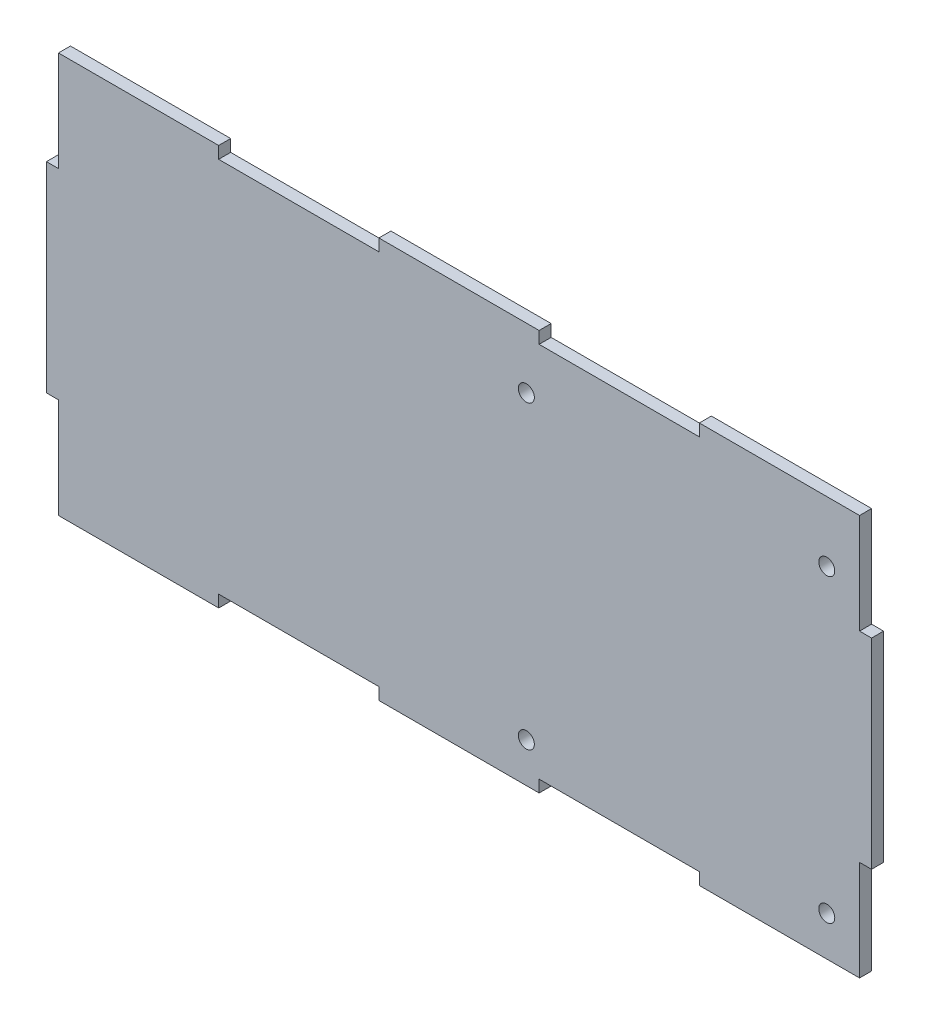
ISO-10303-21;
HEADER;
FILE_DESCRIPTION(('STEP AP214'),'2;1');
FILE_NAME('part.step','',(''),(''),'','','');
FILE_SCHEMA(('AUTOMOTIVE_DESIGN { 1 0 10303 214 1 1 1 1 }'));
ENDSEC;
DATA;
#1=APPLICATION_CONTEXT('core data for automotive mechanical design processes');
#2=APPLICATION_PROTOCOL_DEFINITION('international standard','automotive_design',2000,#1);
#3=PRODUCT_CONTEXT('',#1,'mechanical');
#4=PRODUCT('Part','Part','',(#3));
#5=PRODUCT_RELATED_PRODUCT_CATEGORY('part','',(#4));
#6=PRODUCT_DEFINITION_FORMATION('','',#4);
#7=PRODUCT_DEFINITION_CONTEXT('part definition',#1,'design');
#8=PRODUCT_DEFINITION('design','',#6,#7);
#9=PRODUCT_DEFINITION_SHAPE('','',#8);
#10=(LENGTH_UNIT() NAMED_UNIT(*) SI_UNIT(.MILLI.,.METRE.));
#11=(NAMED_UNIT(*) PLANE_ANGLE_UNIT() SI_UNIT($,.RADIAN.));
#12=(NAMED_UNIT(*) SI_UNIT($,.STERADIAN.) SOLID_ANGLE_UNIT());
#13=UNCERTAINTY_MEASURE_WITH_UNIT(LENGTH_MEASURE(1.E-05),#10,'distance_accuracy_value','');
#14=(GEOMETRIC_REPRESENTATION_CONTEXT(3) GLOBAL_UNCERTAINTY_ASSIGNED_CONTEXT((#13)) GLOBAL_UNIT_ASSIGNED_CONTEXT((#10,
#11,#12)) REPRESENTATION_CONTEXT('',''));
#15=CARTESIAN_POINT('',(0.,0.,0.));
#16=DIRECTION('',(0.,0.,1.));
#17=DIRECTION('',(1.,0.,0.));
#18=AXIS2_PLACEMENT_3D('',#15,#16,#17);
#19=CARTESIAN_POINT('',(193.,282.5,20.));
#20=DIRECTION('',(0.,0.,-1.));
#21=DIRECTION('',(-1.,0.,0.));
#22=AXIS2_PLACEMENT_3D('',#19,#20,#21);
#23=PLANE('',#22);
#24=CARTESIAN_POINT('',(209.810379423596,90.8991683153379,20.));
#25=DIRECTION('',(0.,0.,1.));
#26=DIRECTION('',(1.,0.,0.));
#27=AXIS2_PLACEMENT_3D('',#24,#25,#26);
#28=CIRCLE('',#27,1.99999999999999);
#29=CARTESIAN_POINT('',(211.810379423596,90.8991683153379,20.));
#30=VERTEX_POINT('',#29);
#31=EDGE_CURVE('E236',#30,#30,#28,.T.);
#32=ORIENTED_EDGE('',*,*,#31,.T.);
#33=EDGE_LOOP('',(#32));
#34=FACE_BOUND('',#33,.T.);
#35=CARTESIAN_POINT('',(209.810379423596,165.899168315338,20.));
#36=DIRECTION('',(0.,0.,1.));
#37=DIRECTION('',(1.,0.,0.));
#38=AXIS2_PLACEMENT_3D('',#35,#36,#37);
#39=CIRCLE('',#38,1.99999999999999);
#40=CARTESIAN_POINT('',(211.810379423596,165.899168315338,20.));
#41=VERTEX_POINT('',#40);
#42=EDGE_CURVE('E240',#41,#41,#39,.T.);
#43=ORIENTED_EDGE('',*,*,#42,.T.);
#44=EDGE_LOOP('',(#43));
#45=FACE_BOUND('',#44,.T.);
#46=CARTESIAN_POINT('',(284.810379423596,90.8991683153379,20.));
#47=DIRECTION('',(0.,0.,1.));
#48=DIRECTION('',(1.,0.,0.));
#49=AXIS2_PLACEMENT_3D('',#46,#47,#48);
#50=CIRCLE('',#49,1.99999999999999);
#51=CARTESIAN_POINT('',(286.810379423596,90.8991683153379,20.));
#52=VERTEX_POINT('',#51);
#53=EDGE_CURVE('E242',#52,#52,#50,.T.);
#54=ORIENTED_EDGE('',*,*,#53,.T.);
#55=EDGE_LOOP('',(#54));
#56=FACE_BOUND('',#55,.T.);
#57=CARTESIAN_POINT('',(284.810379423596,165.899168315338,20.));
#58=DIRECTION('',(0.,0.,1.));
#59=DIRECTION('',(1.,0.,0.));
#60=AXIS2_PLACEMENT_3D('',#57,#58,#59);
#61=CIRCLE('',#60,1.99999999999999);
#62=CARTESIAN_POINT('',(286.810379423596,165.899168315338,20.));
#63=VERTEX_POINT('',#62);
#64=EDGE_CURVE('E20',#63,#63,#61,.T.);
#65=ORIENTED_EDGE('',*,*,#64,.T.);
#66=EDGE_LOOP('',(#65));
#67=FACE_BOUND('',#66,.T.);
#68=DIRECTION('',(0.,1.,0.));
#69=VECTOR('',#68,1.);
#70=CARTESIAN_POINT('',(253.,181.,20.));
#71=LINE('',#70,#69);
#72=CARTESIAN_POINT('',(253.,181.,20.));
#73=VERTEX_POINT('',#72);
#74=CARTESIAN_POINT('',(253.,178.,20.));
#75=VERTEX_POINT('',#74);
#76=EDGE_CURVE('E207',#73,#75,#71,.F.);
#77=ORIENTED_EDGE('',*,*,#76,.F.);
#78=DIRECTION('',(1.,0.,0.));
#79=VECTOR('',#78,1.);
#80=CARTESIAN_POINT('',(273.,181.,20.));
#81=LINE('',#80,#79);
#82=CARTESIAN_POINT('',(293.,181.,20.0000000000001));
#83=VERTEX_POINT('',#82);
#84=EDGE_CURVE('E200',#73,#83,#81,.T.);
#85=ORIENTED_EDGE('',*,*,#84,.T.);
#86=DIRECTION('',(0.,1.,0.));
#87=VECTOR('',#86,1.);
#88=CARTESIAN_POINT('',(293.,181.,20.0000000000004));
#89=LINE('',#88,#87);
#90=CARTESIAN_POINT('',(293.,156.,20.0000000000003));
#91=VERTEX_POINT('',#90);
#92=EDGE_CURVE('E204',#91,#83,#89,.T.);
#93=ORIENTED_EDGE('',*,*,#92,.F.);
#94=DIRECTION('',(1.,0.,0.));
#95=VECTOR('',#94,1.);
#96=CARTESIAN_POINT('',(396.,156.,20.0000000000004));
#97=LINE('',#96,#95);
#98=CARTESIAN_POINT('',(296.,156.,20.0000000000001));
#99=VERTEX_POINT('',#98);
#100=EDGE_CURVE('E249',#91,#99,#97,.T.);
#101=ORIENTED_EDGE('',*,*,#100,.T.);
#102=DIRECTION('',(0.,1.,0.));
#103=VECTOR('',#102,1.);
#104=CARTESIAN_POINT('',(296.,281.,20.0000000000002));
#105=LINE('',#104,#103);
#106=CARTESIAN_POINT('',(296.,106.,20.0000000000001));
#107=VERTEX_POINT('',#106);
#108=EDGE_CURVE('E256',#107,#99,#105,.T.);
#109=ORIENTED_EDGE('',*,*,#108,.F.);
#110=DIRECTION('',(1.,0.,0.));
#111=VECTOR('',#110,1.);
#112=CARTESIAN_POINT('',(399.,106.,20.0000000000002));
#113=LINE('',#112,#111);
#114=CARTESIAN_POINT('',(293.,106.,20.0000000000001));
#115=VERTEX_POINT('',#114);
#116=EDGE_CURVE('E263',#107,#115,#113,.F.);
#117=ORIENTED_EDGE('',*,*,#116,.T.);
#118=DIRECTION('',(0.,1.,0.));
#119=VECTOR('',#118,1.);
#120=CARTESIAN_POINT('',(293.,169.,20.0000000000002));
#121=LINE('',#120,#119);
#122=CARTESIAN_POINT('',(293.,81.,20.0000000000001));
#123=VERTEX_POINT('',#122);
#124=EDGE_CURVE('E265',#115,#123,#121,.F.);
#125=ORIENTED_EDGE('',*,*,#124,.T.);
#126=DIRECTION('',(1.,0.,0.));
#127=VECTOR('',#126,1.);
#128=CARTESIAN_POINT('',(196.,81.,20.));
#129=LINE('',#128,#127);
#130=CARTESIAN_POINT('',(253.014555047567,81.,20.));
#131=VERTEX_POINT('',#130);
#132=EDGE_CURVE('E272',#123,#131,#129,.F.);
#133=ORIENTED_EDGE('',*,*,#132,.T.);
#134=DIRECTION('',(0.,1.,0.));
#135=VECTOR('',#134,1.);
#136=CARTESIAN_POINT('',(253.014555047567,78.,20.));
#137=LINE('',#136,#135);
#138=CARTESIAN_POINT('',(253.014555047567,84.,20.));
#139=VERTEX_POINT('',#138);
#140=EDGE_CURVE('E276',#131,#139,#137,.T.);
#141=ORIENTED_EDGE('',*,*,#140,.T.);
#142=DIRECTION('',(1.,0.,0.));
#143=VECTOR('',#142,1.);
#144=CARTESIAN_POINT('',(233.014555047567,84.,20.));
#145=LINE('',#144,#143);
#146=CARTESIAN_POINT('',(213.014555047567,84.,20.));
#147=VERTEX_POINT('',#146);
#148=EDGE_CURVE('E280',#139,#147,#145,.F.);
#149=ORIENTED_EDGE('',*,*,#148,.T.);
#150=DIRECTION('',(0.,1.,0.));
#151=VECTOR('',#150,1.);
#152=CARTESIAN_POINT('',(213.014555047567,78.,20.));
#153=LINE('',#152,#151);
#154=CARTESIAN_POINT('',(213.014555047567,81.,20.));
#155=VERTEX_POINT('',#154);
#156=EDGE_CURVE('E284',#147,#155,#153,.F.);
#157=ORIENTED_EDGE('',*,*,#156,.T.);
#158=DIRECTION('',(1.,0.,0.));
#159=VECTOR('',#158,1.);
#160=CARTESIAN_POINT('',(196.,81.,20.));
#161=LINE('',#160,#159);
#162=CARTESIAN_POINT('',(173.014555047567,81.,20.));
#163=VERTEX_POINT('',#162);
#164=EDGE_CURVE('E288',#155,#163,#161,.F.);
#165=ORIENTED_EDGE('',*,*,#164,.T.);
#166=DIRECTION('',(0.,1.,0.));
#167=VECTOR('',#166,1.);
#168=CARTESIAN_POINT('',(173.014555047567,78.,20.));
#169=LINE('',#168,#167);
#170=CARTESIAN_POINT('',(173.014555047567,84.,20.));
#171=VERTEX_POINT('',#170);
#172=EDGE_CURVE('E292',#163,#171,#169,.T.);
#173=ORIENTED_EDGE('',*,*,#172,.T.);
#174=DIRECTION('',(1.,0.,0.));
#175=VECTOR('',#174,1.);
#176=CARTESIAN_POINT('',(153.014555047567,84.,20.));
#177=LINE('',#176,#175);
#178=CARTESIAN_POINT('',(133.014555047567,84.,20.));
#179=VERTEX_POINT('',#178);
#180=EDGE_CURVE('E296',#171,#179,#177,.F.);
#181=ORIENTED_EDGE('',*,*,#180,.T.);
#182=DIRECTION('',(0.,1.,0.));
#183=VECTOR('',#182,1.);
#184=CARTESIAN_POINT('',(133.014555047567,78.,20.));
#185=LINE('',#184,#183);
#186=CARTESIAN_POINT('',(133.014555047567,81.,20.));
#187=VERTEX_POINT('',#186);
#188=EDGE_CURVE('E300',#179,#187,#185,.F.);
#189=ORIENTED_EDGE('',*,*,#188,.T.);
#190=DIRECTION('',(1.,0.,0.));
#191=VECTOR('',#190,1.);
#192=CARTESIAN_POINT('',(196.,81.,20.));
#193=LINE('',#192,#191);
#194=CARTESIAN_POINT('',(93.,81.,20.));
#195=VERTEX_POINT('',#194);
#196=EDGE_CURVE('E304',#187,#195,#193,.F.);
#197=ORIENTED_EDGE('',*,*,#196,.T.);
#198=DIRECTION('',(0.,1.,0.));
#199=VECTOR('',#198,1.);
#200=CARTESIAN_POINT('',(93.,79.5,20.));
#201=LINE('',#200,#199);
#202=CARTESIAN_POINT('',(93.,106.,20.));
#203=VERTEX_POINT('',#202);
#204=EDGE_CURVE('E308',#195,#203,#201,.T.);
#205=ORIENTED_EDGE('',*,*,#204,.T.);
#206=DIRECTION('',(1.,0.,0.));
#207=VECTOR('',#206,1.);
#208=CARTESIAN_POINT('',(196.,106.,20.));
#209=LINE('',#208,#207);
#210=CARTESIAN_POINT('',(90.,106.,20.));
#211=VERTEX_POINT('',#210);
#212=EDGE_CURVE('E312',#203,#211,#209,.F.);
#213=ORIENTED_EDGE('',*,*,#212,.T.);
#214=DIRECTION('',(0.,1.,0.));
#215=VECTOR('',#214,1.);
#216=CARTESIAN_POINT('',(90.,128.,20.));
#217=LINE('',#216,#215);
#218=CARTESIAN_POINT('',(90.,156.,20.));
#219=VERTEX_POINT('',#218);
#220=EDGE_CURVE('E314',#219,#211,#217,.F.);
#221=ORIENTED_EDGE('',*,*,#220,.F.);
#222=DIRECTION('',(1.,0.,0.));
#223=VECTOR('',#222,1.);
#224=CARTESIAN_POINT('',(193.,156.,20.));
#225=LINE('',#224,#223);
#226=CARTESIAN_POINT('',(93.,156.,20.));
#227=VERTEX_POINT('',#226);
#228=EDGE_CURVE('E322',#219,#227,#225,.T.);
#229=ORIENTED_EDGE('',*,*,#228,.T.);
#230=DIRECTION('',(0.,1.,0.));
#231=VECTOR('',#230,1.);
#232=CARTESIAN_POINT('',(93.,182.5,20.));
#233=LINE('',#232,#231);
#234=CARTESIAN_POINT('',(93.,181.,20.));
#235=VERTEX_POINT('',#234);
#236=EDGE_CURVE('E326',#227,#235,#233,.T.);
#237=ORIENTED_EDGE('',*,*,#236,.T.);
#238=DIRECTION('',(1.,0.,0.));
#239=VECTOR('',#238,1.);
#240=CARTESIAN_POINT('',(113.,181.,20.));
#241=LINE('',#240,#239);
#242=CARTESIAN_POINT('',(133.,181.,20.));
#243=VERTEX_POINT('',#242);
#244=EDGE_CURVE('E330',#235,#243,#241,.T.);
#245=ORIENTED_EDGE('',*,*,#244,.T.);
#246=DIRECTION('',(0.,1.,0.));
#247=VECTOR('',#246,1.);
#248=CARTESIAN_POINT('',(133.,181.,20.));
#249=LINE('',#248,#247);
#250=CARTESIAN_POINT('',(133.,178.,20.));
#251=VERTEX_POINT('',#250);
#252=EDGE_CURVE('E332',#251,#243,#249,.T.);
#253=ORIENTED_EDGE('',*,*,#252,.F.);
#254=DIRECTION('',(1.,0.,0.));
#255=VECTOR('',#254,1.);
#256=CARTESIAN_POINT('',(193.,178.,20.));
#257=LINE('',#256,#255);
#258=CARTESIAN_POINT('',(173.,178.,20.));
#259=VERTEX_POINT('',#258);
#260=EDGE_CURVE('E340',#251,#259,#257,.T.);
#261=ORIENTED_EDGE('',*,*,#260,.T.);
#262=DIRECTION('',(0.,1.,0.));
#263=VECTOR('',#262,1.);
#264=CARTESIAN_POINT('',(173.,181.,20.));
#265=LINE('',#264,#263);
#266=CARTESIAN_POINT('',(173.,181.,20.));
#267=VERTEX_POINT('',#266);
#268=EDGE_CURVE('E342',#267,#259,#265,.F.);
#269=ORIENTED_EDGE('',*,*,#268,.F.);
#270=DIRECTION('',(1.,0.,0.));
#271=VECTOR('',#270,1.);
#272=CARTESIAN_POINT('',(193.,181.,20.));
#273=LINE('',#272,#271);
#274=CARTESIAN_POINT('',(213.,181.,20.));
#275=VERTEX_POINT('',#274);
#276=EDGE_CURVE('E350',#267,#275,#273,.T.);
#277=ORIENTED_EDGE('',*,*,#276,.T.);
#278=DIRECTION('',(0.,1.,0.));
#279=VECTOR('',#278,1.);
#280=CARTESIAN_POINT('',(213.,181.,20.));
#281=LINE('',#280,#279);
#282=CARTESIAN_POINT('',(213.,178.,20.));
#283=VERTEX_POINT('',#282);
#284=EDGE_CURVE('E352',#283,#275,#281,.T.);
#285=ORIENTED_EDGE('',*,*,#284,.F.);
#286=DIRECTION('',(1.,0.,0.));
#287=VECTOR('',#286,1.);
#288=CARTESIAN_POINT('',(193.,178.,20.));
#289=LINE('',#288,#287);
#290=EDGE_CURVE('E360',#283,#75,#289,.T.);
#291=ORIENTED_EDGE('',*,*,#290,.T.);
#292=EDGE_LOOP('',(#77,#85,#93,#101,#109,#117,#125,#133,#141,#149,#157,#165,#173,#181,#189,#197,
#205,#213,#221,#229,#237,#245,#253,#261,#269,#277,#285,#291));
#293=FACE_BOUND('',#292,.T.);
#294=ADVANCED_FACE('F17',(#34,#45,#56,#67,#293),#23,.T.);
#295=CARTESIAN_POINT('',(293.,181.,23.));
#296=DIRECTION('',(1.,0.,0.));
#297=DIRECTION('',(0.,0.,-1.));
#298=AXIS2_PLACEMENT_3D('',#295,#296,#297);
#299=PLANE('',#298);
#300=DIRECTION('',(0.,0.,-1.));
#301=VECTOR('',#300,1.);
#302=CARTESIAN_POINT('',(293.,156.,21.5000000000004));
#303=LINE('',#302,#301);
#304=CARTESIAN_POINT('',(293.,156.,23.0000000000001));
#305=VERTEX_POINT('',#304);
#306=EDGE_CURVE('E215',#305,#91,#303,.T.);
#307=ORIENTED_EDGE('',*,*,#306,.T.);
#308=ORIENTED_EDGE('',*,*,#92,.T.);
#309=DIRECTION('',(0.,0.,-1.));
#310=VECTOR('',#309,1.);
#311=CARTESIAN_POINT('',(293.,181.,21.5));
#312=LINE('',#311,#310);
#313=CARTESIAN_POINT('',(293.,181.,23.));
#314=VERTEX_POINT('',#313);
#315=EDGE_CURVE('E209',#83,#314,#312,.F.);
#316=ORIENTED_EDGE('',*,*,#315,.T.);
#317=DIRECTION('',(0.,-1.,0.));
#318=VECTOR('',#317,1.);
#319=CARTESIAN_POINT('',(293.,282.5,23.));
#320=LINE('',#319,#318);
#321=EDGE_CURVE('E239',#305,#314,#320,.F.);
#322=ORIENTED_EDGE('',*,*,#321,.F.);
#323=EDGE_LOOP('',(#307,#308,#316,#322));
#324=FACE_BOUND('',#323,.T.);
#325=ADVANCED_FACE('F212',(#324),#299,.T.);
#326=CARTESIAN_POINT('',(273.,181.,21.5));
#327=DIRECTION('',(0.,-1.,0.));
#328=DIRECTION('',(0.,0.,-1.));
#329=AXIS2_PLACEMENT_3D('',#326,#327,#328);
#330=PLANE('',#329);
#331=ORIENTED_EDGE('',*,*,#315,.F.);
#332=ORIENTED_EDGE('',*,*,#84,.F.);
#333=DIRECTION('',(0.,0.,1.));
#334=VECTOR('',#333,1.);
#335=CARTESIAN_POINT('',(253.,181.,20.));
#336=LINE('',#335,#334);
#337=CARTESIAN_POINT('',(253.,181.,23.));
#338=VERTEX_POINT('',#337);
#339=EDGE_CURVE('E222',#338,#73,#336,.F.);
#340=ORIENTED_EDGE('',*,*,#339,.F.);
#341=DIRECTION('',(1.,0.,0.));
#342=VECTOR('',#341,1.);
#343=CARTESIAN_POINT('',(193.,181.,23.));
#344=LINE('',#343,#342);
#345=EDGE_CURVE('E220',#314,#338,#344,.F.);
#346=ORIENTED_EDGE('',*,*,#345,.F.);
#347=EDGE_LOOP('',(#331,#332,#340,#346));
#348=FACE_BOUND('',#347,.T.);
#349=ADVANCED_FACE('F218',(#348),#330,.F.);
#350=CARTESIAN_POINT('',(253.,181.,20.));
#351=DIRECTION('',(-1.,0.,0.));
#352=DIRECTION('',(0.,0.,1.));
#353=AXIS2_PLACEMENT_3D('',#350,#351,#352);
#354=PLANE('',#353);
#355=DIRECTION('',(0.,0.,-1.));
#356=VECTOR('',#355,1.);
#357=CARTESIAN_POINT('',(253.,178.,21.5));
#358=LINE('',#357,#356);
#359=CARTESIAN_POINT('',(253.,178.,23.));
#360=VERTEX_POINT('',#359);
#361=EDGE_CURVE('E358',#75,#360,#358,.F.);
#362=ORIENTED_EDGE('',*,*,#361,.T.);
#363=DIRECTION('',(0.,-1.,0.));
#364=VECTOR('',#363,1.);
#365=CARTESIAN_POINT('',(253.,282.5,23.));
#366=LINE('',#365,#364);
#367=EDGE_CURVE('E376',#338,#360,#366,.T.);
#368=ORIENTED_EDGE('',*,*,#367,.F.);
#369=ORIENTED_EDGE('',*,*,#339,.T.);
#370=ORIENTED_EDGE('',*,*,#76,.T.);
#371=EDGE_LOOP('',(#362,#368,#369,#370));
#372=FACE_BOUND('',#371,.T.);
#373=ADVANCED_FACE('F363',(#372),#354,.T.);
#374=CARTESIAN_POINT('',(193.,178.,21.5));
#375=DIRECTION('',(0.,-1.,0.));
#376=DIRECTION('',(0.,0.,-1.));
#377=AXIS2_PLACEMENT_3D('',#374,#375,#376);
#378=PLANE('',#377);
#379=DIRECTION('',(1.,0.,0.));
#380=VECTOR('',#379,1.);
#381=CARTESIAN_POINT('',(193.,178.,23.));
#382=LINE('',#381,#380);
#383=CARTESIAN_POINT('',(213.,178.,23.));
#384=VERTEX_POINT('',#383);
#385=EDGE_CURVE('E370',#360,#384,#382,.F.);
#386=ORIENTED_EDGE('',*,*,#385,.F.);
#387=ORIENTED_EDGE('',*,*,#361,.F.);
#388=ORIENTED_EDGE('',*,*,#290,.F.);
#389=DIRECTION('',(0.,0.,-1.));
#390=VECTOR('',#389,1.);
#391=CARTESIAN_POINT('',(213.,178.,23.));
#392=LINE('',#391,#390);
#393=EDGE_CURVE('E355',#384,#283,#392,.T.);
#394=ORIENTED_EDGE('',*,*,#393,.F.);
#395=EDGE_LOOP('',(#386,#387,#388,#394));
#396=FACE_BOUND('',#395,.T.);
#397=ADVANCED_FACE('F367',(#396),#378,.F.);
#398=CARTESIAN_POINT('',(213.,181.,23.));
#399=DIRECTION('',(1.,0.,0.));
#400=DIRECTION('',(0.,0.,-1.));
#401=AXIS2_PLACEMENT_3D('',#398,#399,#400);
#402=PLANE('',#401);
#403=ORIENTED_EDGE('',*,*,#393,.T.);
#404=ORIENTED_EDGE('',*,*,#284,.T.);
#405=DIRECTION('',(0.,0.,-1.));
#406=VECTOR('',#405,1.);
#407=CARTESIAN_POINT('',(213.,181.,21.5));
#408=LINE('',#407,#406);
#409=CARTESIAN_POINT('',(213.,181.,23.));
#410=VERTEX_POINT('',#409);
#411=EDGE_CURVE('E348',#275,#410,#408,.F.);
#412=ORIENTED_EDGE('',*,*,#411,.T.);
#413=DIRECTION('',(0.,-1.,0.));
#414=VECTOR('',#413,1.);
#415=CARTESIAN_POINT('',(213.,282.5,23.));
#416=LINE('',#415,#414);
#417=EDGE_CURVE('E375',#384,#410,#416,.F.);
#418=ORIENTED_EDGE('',*,*,#417,.F.);
#419=EDGE_LOOP('',(#403,#404,#412,#418));
#420=FACE_BOUND('',#419,.T.);
#421=ADVANCED_FACE('F551',(#420),#402,.T.);
#422=CARTESIAN_POINT('',(193.,181.,21.5));
#423=DIRECTION('',(0.,-1.,0.));
#424=DIRECTION('',(0.,0.,-1.));
#425=AXIS2_PLACEMENT_3D('',#422,#423,#424);
#426=PLANE('',#425);
#427=ORIENTED_EDGE('',*,*,#276,.F.);
#428=DIRECTION('',(0.,0.,1.));
#429=VECTOR('',#428,1.);
#430=CARTESIAN_POINT('',(173.,181.,20.));
#431=LINE('',#430,#429);
#432=CARTESIAN_POINT('',(173.,181.,23.));
#433=VERTEX_POINT('',#432);
#434=EDGE_CURVE('E345',#433,#267,#431,.F.);
#435=ORIENTED_EDGE('',*,*,#434,.F.);
#436=DIRECTION('',(1.,0.,0.));
#437=VECTOR('',#436,1.);
#438=CARTESIAN_POINT('',(193.,181.,23.));
#439=LINE('',#438,#437);
#440=EDGE_CURVE('E383',#410,#433,#439,.F.);
#441=ORIENTED_EDGE('',*,*,#440,.F.);
#442=ORIENTED_EDGE('',*,*,#411,.F.);
#443=EDGE_LOOP('',(#427,#435,#441,#442));
#444=FACE_BOUND('',#443,.T.);
#445=ADVANCED_FACE('F548',(#444),#426,.F.);
#446=CARTESIAN_POINT('',(173.,181.,20.));
#447=DIRECTION('',(-1.,0.,0.));
#448=DIRECTION('',(0.,0.,1.));
#449=AXIS2_PLACEMENT_3D('',#446,#447,#448);
#450=PLANE('',#449);
#451=DIRECTION('',(0.,0.,-1.));
#452=VECTOR('',#451,1.);
#453=CARTESIAN_POINT('',(173.,178.,21.5));
#454=LINE('',#453,#452);
#455=CARTESIAN_POINT('',(173.,178.,23.));
#456=VERTEX_POINT('',#455);
#457=EDGE_CURVE('E338',#259,#456,#454,.F.);
#458=ORIENTED_EDGE('',*,*,#457,.T.);
#459=DIRECTION('',(0.,-1.,0.));
#460=VECTOR('',#459,1.);
#461=CARTESIAN_POINT('',(173.,282.5,23.));
#462=LINE('',#461,#460);
#463=EDGE_CURVE('E386',#433,#456,#462,.T.);
#464=ORIENTED_EDGE('',*,*,#463,.F.);
#465=ORIENTED_EDGE('',*,*,#434,.T.);
#466=ORIENTED_EDGE('',*,*,#268,.T.);
#467=EDGE_LOOP('',(#458,#464,#465,#466));
#468=FACE_BOUND('',#467,.T.);
#469=ADVANCED_FACE('F544',(#468),#450,.T.);
#470=CARTESIAN_POINT('',(193.,178.,21.5));
#471=DIRECTION('',(0.,-1.,0.));
#472=DIRECTION('',(0.,0.,-1.));
#473=AXIS2_PLACEMENT_3D('',#470,#471,#472);
#474=PLANE('',#473);
#475=DIRECTION('',(1.,0.,0.));
#476=VECTOR('',#475,1.);
#477=CARTESIAN_POINT('',(193.,178.,23.));
#478=LINE('',#477,#476);
#479=CARTESIAN_POINT('',(133.,178.,23.));
#480=VERTEX_POINT('',#479);
#481=EDGE_CURVE('E389',#456,#480,#478,.F.);
#482=ORIENTED_EDGE('',*,*,#481,.F.);
#483=ORIENTED_EDGE('',*,*,#457,.F.);
#484=ORIENTED_EDGE('',*,*,#260,.F.);
#485=DIRECTION('',(0.,0.,-1.));
#486=VECTOR('',#485,1.);
#487=CARTESIAN_POINT('',(133.,178.,23.));
#488=LINE('',#487,#486);
#489=EDGE_CURVE('E335',#480,#251,#488,.T.);
#490=ORIENTED_EDGE('',*,*,#489,.F.);
#491=EDGE_LOOP('',(#482,#483,#484,#490));
#492=FACE_BOUND('',#491,.T.);
#493=ADVANCED_FACE('F540',(#492),#474,.F.);
#494=CARTESIAN_POINT('',(133.,181.,23.));
#495=DIRECTION('',(1.,0.,0.));
#496=DIRECTION('',(0.,0.,-1.));
#497=AXIS2_PLACEMENT_3D('',#494,#495,#496);
#498=PLANE('',#497);
#499=ORIENTED_EDGE('',*,*,#489,.T.);
#500=ORIENTED_EDGE('',*,*,#252,.T.);
#501=DIRECTION('',(0.,0.,-1.));
#502=VECTOR('',#501,1.);
#503=CARTESIAN_POINT('',(133.,181.,21.5));
#504=LINE('',#503,#502);
#505=CARTESIAN_POINT('',(133.,181.,23.));
#506=VERTEX_POINT('',#505);
#507=EDGE_CURVE('E328',#243,#506,#504,.F.);
#508=ORIENTED_EDGE('',*,*,#507,.T.);
#509=DIRECTION('',(0.,-1.,0.));
#510=VECTOR('',#509,1.);
#511=CARTESIAN_POINT('',(133.,282.5,23.));
#512=LINE('',#511,#510);
#513=EDGE_CURVE('E392',#480,#506,#512,.F.);
#514=ORIENTED_EDGE('',*,*,#513,.F.);
#515=EDGE_LOOP('',(#499,#500,#508,#514));
#516=FACE_BOUND('',#515,.T.);
#517=ADVANCED_FACE('F536',(#516),#498,.T.);
#518=CARTESIAN_POINT('',(113.,181.,21.5));
#519=DIRECTION('',(0.,-1.,0.));
#520=DIRECTION('',(0.,0.,-1.));
#521=AXIS2_PLACEMENT_3D('',#518,#519,#520);
#522=PLANE('',#521);
#523=DIRECTION('',(1.,0.,0.));
#524=VECTOR('',#523,1.);
#525=CARTESIAN_POINT('',(193.,181.,23.));
#526=LINE('',#525,#524);
#527=CARTESIAN_POINT('',(93.,181.,23.));
#528=VERTEX_POINT('',#527);
#529=EDGE_CURVE('E395',#506,#528,#526,.F.);
#530=ORIENTED_EDGE('',*,*,#529,.F.);
#531=ORIENTED_EDGE('',*,*,#507,.F.);
#532=ORIENTED_EDGE('',*,*,#244,.F.);
#533=DIRECTION('',(0.,0.,-1.));
#534=VECTOR('',#533,1.);
#535=CARTESIAN_POINT('',(93.,181.,21.5));
#536=LINE('',#535,#534);
#537=EDGE_CURVE('E324',#235,#528,#536,.F.);
#538=ORIENTED_EDGE('',*,*,#537,.T.);
#539=EDGE_LOOP('',(#530,#531,#532,#538));
#540=FACE_BOUND('',#539,.T.);
#541=ADVANCED_FACE('F532',(#540),#522,.F.);
#542=CARTESIAN_POINT('',(93.,182.5,21.5));
#543=DIRECTION('',(1.,0.,0.));
#544=DIRECTION('',(0.,0.,-1.));
#545=AXIS2_PLACEMENT_3D('',#542,#543,#544);
#546=PLANE('',#545);
#547=ORIENTED_EDGE('',*,*,#236,.F.);
#548=DIRECTION('',(0.,0.,-1.));
#549=VECTOR('',#548,1.);
#550=CARTESIAN_POINT('',(93.,156.,21.5));
#551=LINE('',#550,#549);
#552=CARTESIAN_POINT('',(93.,156.,23.));
#553=VERTEX_POINT('',#552);
#554=EDGE_CURVE('E320',#227,#553,#551,.F.);
#555=ORIENTED_EDGE('',*,*,#554,.T.);
#556=DIRECTION('',(0.,-1.,0.));
#557=VECTOR('',#556,1.);
#558=CARTESIAN_POINT('',(93.,282.5,23.));
#559=LINE('',#558,#557);
#560=EDGE_CURVE('E398',#528,#553,#559,.T.);
#561=ORIENTED_EDGE('',*,*,#560,.F.);
#562=ORIENTED_EDGE('',*,*,#537,.F.);
#563=EDGE_LOOP('',(#547,#555,#561,#562));
#564=FACE_BOUND('',#563,.T.);
#565=ADVANCED_FACE('F528',(#564),#546,.F.);
#566=CARTESIAN_POINT('',(193.,156.,21.5));
#567=DIRECTION('',(0.,-1.,0.));
#568=DIRECTION('',(0.,0.,-1.));
#569=AXIS2_PLACEMENT_3D('',#566,#567,#568);
#570=PLANE('',#569);
#571=ORIENTED_EDGE('',*,*,#228,.F.);
#572=DIRECTION('',(0.,0.,1.));
#573=VECTOR('',#572,1.);
#574=CARTESIAN_POINT('',(90.,156.,23.));
#575=LINE('',#574,#573);
#576=CARTESIAN_POINT('',(90.,156.,23.));
#577=VERTEX_POINT('',#576);
#578=EDGE_CURVE('E317',#577,#219,#575,.F.);
#579=ORIENTED_EDGE('',*,*,#578,.F.);
#580=DIRECTION('',(1.,0.,0.));
#581=VECTOR('',#580,1.);
#582=CARTESIAN_POINT('',(193.,156.,23.));
#583=LINE('',#582,#581);
#584=EDGE_CURVE('E401',#553,#577,#583,.F.);
#585=ORIENTED_EDGE('',*,*,#584,.F.);
#586=ORIENTED_EDGE('',*,*,#554,.F.);
#587=EDGE_LOOP('',(#571,#579,#585,#586));
#588=FACE_BOUND('',#587,.T.);
#589=ADVANCED_FACE('F522',(#588),#570,.F.);
#590=CARTESIAN_POINT('',(90.,128.,23.));
#591=DIRECTION('',(-1.,0.,0.));
#592=DIRECTION('',(0.,0.,1.));
#593=AXIS2_PLACEMENT_3D('',#590,#591,#592);
#594=PLANE('',#593);
#595=DIRECTION('',(0.,0.,1.));
#596=VECTOR('',#595,1.);
#597=CARTESIAN_POINT('',(90.,106.,23.));
#598=LINE('',#597,#596);
#599=CARTESIAN_POINT('',(90.,106.,23.));
#600=VERTEX_POINT('',#599);
#601=EDGE_CURVE('E310',#211,#600,#598,.T.);
#602=ORIENTED_EDGE('',*,*,#601,.T.);
#603=DIRECTION('',(0.,-1.,0.));
#604=VECTOR('',#603,1.);
#605=CARTESIAN_POINT('',(90.,282.5,23.));
#606=LINE('',#605,#604);
#607=EDGE_CURVE('E404',#577,#600,#606,.T.);
#608=ORIENTED_EDGE('',*,*,#607,.F.);
#609=ORIENTED_EDGE('',*,*,#578,.T.);
#610=ORIENTED_EDGE('',*,*,#220,.T.);
#611=EDGE_LOOP('',(#602,#608,#609,#610));
#612=FACE_BOUND('',#611,.T.);
#613=ADVANCED_FACE('F518',(#612),#594,.T.);
#614=CARTESIAN_POINT('',(196.,106.,23.));
#615=DIRECTION('',(0.,1.,0.));
#616=DIRECTION('',(0.,0.,1.));
#617=AXIS2_PLACEMENT_3D('',#614,#615,#616);
#618=PLANE('',#617);
#619=DIRECTION('',(1.,0.,0.));
#620=VECTOR('',#619,1.);
#621=CARTESIAN_POINT('',(193.,106.,23.));
#622=LINE('',#621,#620);
#623=CARTESIAN_POINT('',(93.,106.,23.));
#624=VERTEX_POINT('',#623);
#625=EDGE_CURVE('E407',#600,#624,#622,.T.);
#626=ORIENTED_EDGE('',*,*,#625,.F.);
#627=ORIENTED_EDGE('',*,*,#601,.F.);
#628=ORIENTED_EDGE('',*,*,#212,.F.);
#629=DIRECTION('',(0.,0.,-1.));
#630=VECTOR('',#629,1.);
#631=CARTESIAN_POINT('',(93.,106.,21.5));
#632=LINE('',#631,#630);
#633=EDGE_CURVE('E306',#203,#624,#632,.F.);
#634=ORIENTED_EDGE('',*,*,#633,.T.);
#635=EDGE_LOOP('',(#626,#627,#628,#634));
#636=FACE_BOUND('',#635,.T.);
#637=ADVANCED_FACE('F514',(#636),#618,.F.);
#638=CARTESIAN_POINT('',(93.,79.5,21.5));
#639=DIRECTION('',(1.,0.,0.));
#640=DIRECTION('',(0.,0.,-1.));
#641=AXIS2_PLACEMENT_3D('',#638,#639,#640);
#642=PLANE('',#641);
#643=DIRECTION('',(0.,-1.,0.));
#644=VECTOR('',#643,1.);
#645=CARTESIAN_POINT('',(93.,282.5,23.));
#646=LINE('',#645,#644);
#647=CARTESIAN_POINT('',(93.,81.,23.));
#648=VERTEX_POINT('',#647);
#649=EDGE_CURVE('E410',#624,#648,#646,.T.);
#650=ORIENTED_EDGE('',*,*,#649,.F.);
#651=ORIENTED_EDGE('',*,*,#633,.F.);
#652=ORIENTED_EDGE('',*,*,#204,.F.);
#653=DIRECTION('',(0.,0.,1.));
#654=VECTOR('',#653,1.);
#655=CARTESIAN_POINT('',(93.,81.,23.));
#656=LINE('',#655,#654);
#657=EDGE_CURVE('E302',#195,#648,#656,.T.);
#658=ORIENTED_EDGE('',*,*,#657,.T.);
#659=EDGE_LOOP('',(#650,#651,#652,#658));
#660=FACE_BOUND('',#659,.T.);
#661=ADVANCED_FACE('F511',(#660),#642,.F.);
#662=CARTESIAN_POINT('',(196.,81.,23.));
#663=DIRECTION('',(0.,1.,0.));
#664=DIRECTION('',(0.,0.,1.));
#665=AXIS2_PLACEMENT_3D('',#662,#663,#664);
#666=PLANE('',#665);
#667=ORIENTED_EDGE('',*,*,#196,.F.);
#668=DIRECTION('',(0.,0.,1.));
#669=VECTOR('',#668,1.);
#670=CARTESIAN_POINT('',(133.014555047567,81.,20.));
#671=LINE('',#670,#669);
#672=CARTESIAN_POINT('',(133.014555047567,81.,23.));
#673=VERTEX_POINT('',#672);
#674=EDGE_CURVE('E298',#187,#673,#671,.T.);
#675=ORIENTED_EDGE('',*,*,#674,.T.);
#676=DIRECTION('',(1.,0.,0.));
#677=VECTOR('',#676,1.);
#678=CARTESIAN_POINT('',(193.,81.,23.));
#679=LINE('',#678,#677);
#680=EDGE_CURVE('E413',#648,#673,#679,.T.);
#681=ORIENTED_EDGE('',*,*,#680,.F.);
#682=ORIENTED_EDGE('',*,*,#657,.F.);
#683=EDGE_LOOP('',(#667,#675,#681,#682));
#684=FACE_BOUND('',#683,.T.);
#685=ADVANCED_FACE('F504',(#684),#666,.F.);
#686=CARTESIAN_POINT('',(133.014555047567,78.,20.));
#687=DIRECTION('',(-1.,0.,0.));
#688=DIRECTION('',(0.,0.,1.));
#689=AXIS2_PLACEMENT_3D('',#686,#687,#688);
#690=PLANE('',#689);
#691=ORIENTED_EDGE('',*,*,#188,.F.);
#692=DIRECTION('',(0.,0.,1.));
#693=VECTOR('',#692,1.);
#694=CARTESIAN_POINT('',(133.014555047567,84.,21.5));
#695=LINE('',#694,#693);
#696=CARTESIAN_POINT('',(133.014555047567,84.,23.));
#697=VERTEX_POINT('',#696);
#698=EDGE_CURVE('E294',#179,#697,#695,.T.);
#699=ORIENTED_EDGE('',*,*,#698,.T.);
#700=DIRECTION('',(0.,-1.,0.));
#701=VECTOR('',#700,1.);
#702=CARTESIAN_POINT('',(133.014555047567,282.5,23.));
#703=LINE('',#702,#701);
#704=EDGE_CURVE('E416',#673,#697,#703,.F.);
#705=ORIENTED_EDGE('',*,*,#704,.F.);
#706=ORIENTED_EDGE('',*,*,#674,.F.);
#707=EDGE_LOOP('',(#691,#699,#705,#706));
#708=FACE_BOUND('',#707,.T.);
#709=ADVANCED_FACE('F500',(#708),#690,.F.);
#710=CARTESIAN_POINT('',(153.014555047567,84.,21.5));
#711=DIRECTION('',(0.,1.,0.));
#712=DIRECTION('',(0.,0.,1.));
#713=AXIS2_PLACEMENT_3D('',#710,#711,#712);
#714=PLANE('',#713);
#715=ORIENTED_EDGE('',*,*,#698,.F.);
#716=ORIENTED_EDGE('',*,*,#180,.F.);
#717=DIRECTION('',(0.,0.,-1.));
#718=VECTOR('',#717,1.);
#719=CARTESIAN_POINT('',(173.014555047567,84.,23.));
#720=LINE('',#719,#718);
#721=CARTESIAN_POINT('',(173.014555047567,84.,23.));
#722=VERTEX_POINT('',#721);
#723=EDGE_CURVE('E290',#171,#722,#720,.F.);
#724=ORIENTED_EDGE('',*,*,#723,.T.);
#725=DIRECTION('',(1.,0.,0.));
#726=VECTOR('',#725,1.);
#727=CARTESIAN_POINT('',(193.,84.,23.));
#728=LINE('',#727,#726);
#729=EDGE_CURVE('E419',#697,#722,#728,.T.);
#730=ORIENTED_EDGE('',*,*,#729,.F.);
#731=EDGE_LOOP('',(#715,#716,#724,#730));
#732=FACE_BOUND('',#731,.T.);
#733=ADVANCED_FACE('F495',(#732),#714,.F.);
#734=CARTESIAN_POINT('',(173.014555047567,78.,23.));
#735=DIRECTION('',(1.,0.,0.));
#736=DIRECTION('',(0.,0.,-1.));
#737=AXIS2_PLACEMENT_3D('',#734,#735,#736);
#738=PLANE('',#737);
#739=DIRECTION('',(0.,-1.,0.));
#740=VECTOR('',#739,1.);
#741=CARTESIAN_POINT('',(173.014555047567,282.5,23.));
#742=LINE('',#741,#740);
#743=CARTESIAN_POINT('',(173.014555047567,81.,23.));
#744=VERTEX_POINT('',#743);
#745=EDGE_CURVE('E422',#722,#744,#742,.T.);
#746=ORIENTED_EDGE('',*,*,#745,.F.);
#747=ORIENTED_EDGE('',*,*,#723,.F.);
#748=ORIENTED_EDGE('',*,*,#172,.F.);
#749=DIRECTION('',(0.,0.,1.));
#750=VECTOR('',#749,1.);
#751=CARTESIAN_POINT('',(173.014555047567,81.,23.));
#752=LINE('',#751,#750);
#753=EDGE_CURVE('E286',#163,#744,#752,.T.);
#754=ORIENTED_EDGE('',*,*,#753,.T.);
#755=EDGE_LOOP('',(#746,#747,#748,#754));
#756=FACE_BOUND('',#755,.T.);
#757=ADVANCED_FACE('F491',(#756),#738,.F.);
#758=CARTESIAN_POINT('',(196.,81.,23.));
#759=DIRECTION('',(0.,1.,0.));
#760=DIRECTION('',(0.,0.,1.));
#761=AXIS2_PLACEMENT_3D('',#758,#759,#760);
#762=PLANE('',#761);
#763=DIRECTION('',(1.,0.,0.));
#764=VECTOR('',#763,1.);
#765=CARTESIAN_POINT('',(193.,81.,23.));
#766=LINE('',#765,#764);
#767=CARTESIAN_POINT('',(213.014555047567,81.,23.));
#768=VERTEX_POINT('',#767);
#769=EDGE_CURVE('E425',#744,#768,#766,.T.);
#770=ORIENTED_EDGE('',*,*,#769,.F.);
#771=ORIENTED_EDGE('',*,*,#753,.F.);
#772=ORIENTED_EDGE('',*,*,#164,.F.);
#773=DIRECTION('',(0.,0.,1.));
#774=VECTOR('',#773,1.);
#775=CARTESIAN_POINT('',(213.014555047567,81.,20.));
#776=LINE('',#775,#774);
#777=EDGE_CURVE('E282',#155,#768,#776,.T.);
#778=ORIENTED_EDGE('',*,*,#777,.T.);
#779=EDGE_LOOP('',(#770,#771,#772,#778));
#780=FACE_BOUND('',#779,.T.);
#781=ADVANCED_FACE('F484',(#780),#762,.F.);
#782=CARTESIAN_POINT('',(213.014555047567,78.,20.));
#783=DIRECTION('',(-1.,0.,0.));
#784=DIRECTION('',(0.,0.,1.));
#785=AXIS2_PLACEMENT_3D('',#782,#783,#784);
#786=PLANE('',#785);
#787=ORIENTED_EDGE('',*,*,#156,.F.);
#788=DIRECTION('',(0.,0.,1.));
#789=VECTOR('',#788,1.);
#790=CARTESIAN_POINT('',(213.014555047567,84.,21.5));
#791=LINE('',#790,#789);
#792=CARTESIAN_POINT('',(213.014555047567,84.,23.));
#793=VERTEX_POINT('',#792);
#794=EDGE_CURVE('E278',#147,#793,#791,.T.);
#795=ORIENTED_EDGE('',*,*,#794,.T.);
#796=DIRECTION('',(0.,-1.,0.));
#797=VECTOR('',#796,1.);
#798=CARTESIAN_POINT('',(213.014555047567,282.5,23.));
#799=LINE('',#798,#797);
#800=EDGE_CURVE('E428',#768,#793,#799,.F.);
#801=ORIENTED_EDGE('',*,*,#800,.F.);
#802=ORIENTED_EDGE('',*,*,#777,.F.);
#803=EDGE_LOOP('',(#787,#795,#801,#802));
#804=FACE_BOUND('',#803,.T.);
#805=ADVANCED_FACE('F480',(#804),#786,.F.);
#806=CARTESIAN_POINT('',(233.014555047567,84.,21.5));
#807=DIRECTION('',(0.,1.,0.));
#808=DIRECTION('',(0.,0.,1.));
#809=AXIS2_PLACEMENT_3D('',#806,#807,#808);
#810=PLANE('',#809);
#811=ORIENTED_EDGE('',*,*,#794,.F.);
#812=ORIENTED_EDGE('',*,*,#148,.F.);
#813=DIRECTION('',(0.,0.,-1.));
#814=VECTOR('',#813,1.);
#815=CARTESIAN_POINT('',(253.014555047567,84.,23.));
#816=LINE('',#815,#814);
#817=CARTESIAN_POINT('',(253.014555047567,84.,23.));
#818=VERTEX_POINT('',#817);
#819=EDGE_CURVE('E274',#139,#818,#816,.F.);
#820=ORIENTED_EDGE('',*,*,#819,.T.);
#821=DIRECTION('',(1.,0.,0.));
#822=VECTOR('',#821,1.);
#823=CARTESIAN_POINT('',(193.,84.,23.));
#824=LINE('',#823,#822);
#825=EDGE_CURVE('E431',#793,#818,#824,.T.);
#826=ORIENTED_EDGE('',*,*,#825,.F.);
#827=EDGE_LOOP('',(#811,#812,#820,#826));
#828=FACE_BOUND('',#827,.T.);
#829=ADVANCED_FACE('F475',(#828),#810,.F.);
#830=CARTESIAN_POINT('',(253.014555047567,78.,23.));
#831=DIRECTION('',(1.,0.,0.));
#832=DIRECTION('',(0.,0.,-1.));
#833=AXIS2_PLACEMENT_3D('',#830,#831,#832);
#834=PLANE('',#833);
#835=DIRECTION('',(0.,-1.,0.));
#836=VECTOR('',#835,1.);
#837=CARTESIAN_POINT('',(253.014555047567,282.5,23.));
#838=LINE('',#837,#836);
#839=CARTESIAN_POINT('',(253.014555047567,81.,23.));
#840=VERTEX_POINT('',#839);
#841=EDGE_CURVE('E434',#818,#840,#838,.T.);
#842=ORIENTED_EDGE('',*,*,#841,.F.);
#843=ORIENTED_EDGE('',*,*,#819,.F.);
#844=ORIENTED_EDGE('',*,*,#140,.F.);
#845=DIRECTION('',(0.,0.,1.));
#846=VECTOR('',#845,1.);
#847=CARTESIAN_POINT('',(253.014555047567,81.,23.));
#848=LINE('',#847,#846);
#849=EDGE_CURVE('E270',#131,#840,#848,.T.);
#850=ORIENTED_EDGE('',*,*,#849,.T.);
#851=EDGE_LOOP('',(#842,#843,#844,#850));
#852=FACE_BOUND('',#851,.T.);
#853=ADVANCED_FACE('F471',(#852),#834,.F.);
#854=CARTESIAN_POINT('',(196.,81.,23.));
#855=DIRECTION('',(0.,1.,0.));
#856=DIRECTION('',(0.,0.,1.));
#857=AXIS2_PLACEMENT_3D('',#854,#855,#856);
#858=PLANE('',#857);
#859=DIRECTION('',(1.,0.,0.));
#860=VECTOR('',#859,1.);
#861=CARTESIAN_POINT('',(193.,81.,23.));
#862=LINE('',#861,#860);
#863=CARTESIAN_POINT('',(293.,81.,23.));
#864=VERTEX_POINT('',#863);
#865=EDGE_CURVE('E437',#840,#864,#862,.T.);
#866=ORIENTED_EDGE('',*,*,#865,.F.);
#867=ORIENTED_EDGE('',*,*,#849,.F.);
#868=ORIENTED_EDGE('',*,*,#132,.F.);
#869=DIRECTION('',(0.,0.,1.));
#870=VECTOR('',#869,1.);
#871=CARTESIAN_POINT('',(293.,81.,1.50000000000037));
#872=LINE('',#871,#870);
#873=EDGE_CURVE('E268',#123,#864,#872,.T.);
#874=ORIENTED_EDGE('',*,*,#873,.T.);
#875=EDGE_LOOP('',(#866,#867,#868,#874));
#876=FACE_BOUND('',#875,.T.);
#877=ADVANCED_FACE('F464',(#876),#858,.F.);
#878=CARTESIAN_POINT('',(293.,169.,1.50000000000037));
#879=DIRECTION('',(-1.,0.,0.));
#880=DIRECTION('',(0.,0.,1.));
#881=AXIS2_PLACEMENT_3D('',#878,#879,#880);
#882=PLANE('',#881);
#883=DIRECTION('',(0.,0.,1.));
#884=VECTOR('',#883,1.);
#885=CARTESIAN_POINT('',(293.,106.,23.0000000000002));
#886=LINE('',#885,#884);
#887=CARTESIAN_POINT('',(293.,106.,23.));
#888=VERTEX_POINT('',#887);
#889=EDGE_CURVE('E261',#115,#888,#886,.T.);
#890=ORIENTED_EDGE('',*,*,#889,.T.);
#891=DIRECTION('',(0.,-1.,0.));
#892=VECTOR('',#891,1.);
#893=CARTESIAN_POINT('',(293.,282.5,23.));
#894=LINE('',#893,#892);
#895=EDGE_CURVE('E440',#864,#888,#894,.F.);
#896=ORIENTED_EDGE('',*,*,#895,.F.);
#897=ORIENTED_EDGE('',*,*,#873,.F.);
#898=ORIENTED_EDGE('',*,*,#124,.F.);
#899=EDGE_LOOP('',(#890,#896,#897,#898));
#900=FACE_BOUND('',#899,.T.);
#901=ADVANCED_FACE('F460',(#900),#882,.F.);
#902=CARTESIAN_POINT('',(399.,106.,23.0000000000002));
#903=DIRECTION('',(0.,1.,0.));
#904=DIRECTION('',(0.,0.,1.));
#905=AXIS2_PLACEMENT_3D('',#902,#903,#904);
#906=PLANE('',#905);
#907=DIRECTION('',(1.,0.,0.));
#908=VECTOR('',#907,1.);
#909=CARTESIAN_POINT('',(193.,106.,23.));
#910=LINE('',#909,#908);
#911=CARTESIAN_POINT('',(296.,106.,23.0000000000002));
#912=VERTEX_POINT('',#911);
#913=EDGE_CURVE('E443',#888,#912,#910,.T.);
#914=ORIENTED_EDGE('',*,*,#913,.F.);
#915=ORIENTED_EDGE('',*,*,#889,.F.);
#916=ORIENTED_EDGE('',*,*,#116,.F.);
#917=DIRECTION('',(0.,0.,-1.));
#918=VECTOR('',#917,1.);
#919=CARTESIAN_POINT('',(296.,106.,23.));
#920=LINE('',#919,#918);
#921=EDGE_CURVE('E258',#912,#107,#920,.T.);
#922=ORIENTED_EDGE('',*,*,#921,.F.);
#923=EDGE_LOOP('',(#914,#915,#916,#922));
#924=FACE_BOUND('',#923,.T.);
#925=ADVANCED_FACE('F455',(#924),#906,.F.);
#926=CARTESIAN_POINT('',(296.,281.,23.));
#927=DIRECTION('',(1.,0.,0.));
#928=DIRECTION('',(0.,0.,-1.));
#929=AXIS2_PLACEMENT_3D('',#926,#927,#928);
#930=PLANE('',#929);
#931=ORIENTED_EDGE('',*,*,#921,.T.);
#932=ORIENTED_EDGE('',*,*,#108,.T.);
#933=DIRECTION('',(0.,0.,-1.));
#934=VECTOR('',#933,1.);
#935=CARTESIAN_POINT('',(296.,156.,21.5000000000004));
#936=LINE('',#935,#934);
#937=CARTESIAN_POINT('',(296.,156.,23.0000000000003));
#938=VERTEX_POINT('',#937);
#939=EDGE_CURVE('E35',#99,#938,#936,.F.);
#940=ORIENTED_EDGE('',*,*,#939,.T.);
#941=DIRECTION('',(0.,-1.,0.));
#942=VECTOR('',#941,1.);
#943=CARTESIAN_POINT('',(296.,282.5,23.));
#944=LINE('',#943,#942);
#945=EDGE_CURVE('E446',#912,#938,#944,.F.);
#946=ORIENTED_EDGE('',*,*,#945,.F.);
#947=EDGE_LOOP('',(#931,#932,#940,#946));
#948=FACE_BOUND('',#947,.T.);
#949=ADVANCED_FACE('F452',(#948),#930,.T.);
#950=CARTESIAN_POINT('',(396.,156.,21.5000000000004));
#951=DIRECTION('',(0.,-1.,0.));
#952=DIRECTION('',(0.,0.,-1.));
#953=AXIS2_PLACEMENT_3D('',#950,#951,#952);
#954=PLANE('',#953);
#955=ORIENTED_EDGE('',*,*,#100,.F.);
#956=ORIENTED_EDGE('',*,*,#306,.F.);
#957=DIRECTION('',(1.,0.,0.));
#958=VECTOR('',#957,1.);
#959=CARTESIAN_POINT('',(193.,156.,23.));
#960=LINE('',#959,#958);
#961=EDGE_CURVE('E235',#938,#305,#960,.F.);
#962=ORIENTED_EDGE('',*,*,#961,.F.);
#963=ORIENTED_EDGE('',*,*,#939,.F.);
#964=EDGE_LOOP('',(#955,#956,#962,#963));
#965=FACE_BOUND('',#964,.T.);
#966=ADVANCED_FACE('F450',(#965),#954,.F.);
#967=CARTESIAN_POINT('',(284.810379423596,165.899168315338,20.));
#968=DIRECTION('',(0.,0.,1.));
#969=DIRECTION('',(1.,0.,0.));
#970=AXIS2_PLACEMENT_3D('',#967,#968,#969);
#971=CYLINDRICAL_SURFACE('',#970,1.99999999999999);
#972=CARTESIAN_POINT('',(284.810379423596,165.899168315338,23.));
#973=DIRECTION('',(0.,0.,1.));
#974=DIRECTION('',(1.,0.,0.));
#975=AXIS2_PLACEMENT_3D('',#972,#973,#974);
#976=CIRCLE('',#975,1.99999999999999);
#977=CARTESIAN_POINT('',(286.810379423596,165.899168315338,23.));
#978=VERTEX_POINT('',#977);
#979=EDGE_CURVE('E232',#978,#978,#976,.F.);
#980=ORIENTED_EDGE('',*,*,#979,.F.);
#981=EDGE_LOOP('',(#980));
#982=FACE_BOUND('',#981,.T.);
#983=ORIENTED_EDGE('',*,*,#64,.F.);
#984=EDGE_LOOP('',(#983));
#985=FACE_BOUND('',#984,.T.);
#986=ADVANCED_FACE('F579',(#982,#985),#971,.F.);
#987=CARTESIAN_POINT('',(284.810379423596,90.8991683153379,20.));
#988=DIRECTION('',(0.,0.,1.));
#989=DIRECTION('',(1.,0.,0.));
#990=AXIS2_PLACEMENT_3D('',#987,#988,#989);
#991=CYLINDRICAL_SURFACE('',#990,1.99999999999999);
#992=CARTESIAN_POINT('',(284.810379423596,90.8991683153379,23.));
#993=DIRECTION('',(0.,0.,1.));
#994=DIRECTION('',(1.,0.,0.));
#995=AXIS2_PLACEMENT_3D('',#992,#993,#994);
#996=CIRCLE('',#995,1.99999999999999);
#997=CARTESIAN_POINT('',(286.810379423596,90.8991683153379,23.));
#998=VERTEX_POINT('',#997);
#999=EDGE_CURVE('E229',#998,#998,#996,.F.);
#1000=ORIENTED_EDGE('',*,*,#999,.F.);
#1001=EDGE_LOOP('',(#1000));
#1002=FACE_BOUND('',#1001,.T.);
#1003=ORIENTED_EDGE('',*,*,#53,.F.);
#1004=EDGE_LOOP('',(#1003));
#1005=FACE_BOUND('',#1004,.T.);
#1006=ADVANCED_FACE('F575',(#1002,#1005),#991,.F.);
#1007=CARTESIAN_POINT('',(209.810379423596,165.899168315338,20.));
#1008=DIRECTION('',(0.,0.,1.));
#1009=DIRECTION('',(1.,0.,0.));
#1010=AXIS2_PLACEMENT_3D('',#1007,#1008,#1009);
#1011=CYLINDRICAL_SURFACE('',#1010,1.99999999999999);
#1012=CARTESIAN_POINT('',(209.810379423596,165.899168315338,23.));
#1013=DIRECTION('',(0.,0.,1.));
#1014=DIRECTION('',(1.,0.,0.));
#1015=AXIS2_PLACEMENT_3D('',#1012,#1013,#1014);
#1016=CIRCLE('',#1015,1.99999999999999);
#1017=CARTESIAN_POINT('',(211.810379423596,165.899168315338,23.));
#1018=VERTEX_POINT('',#1017);
#1019=EDGE_CURVE('E26',#1018,#1018,#1016,.F.);
#1020=ORIENTED_EDGE('',*,*,#1019,.F.);
#1021=EDGE_LOOP('',(#1020));
#1022=FACE_BOUND('',#1021,.T.);
#1023=ORIENTED_EDGE('',*,*,#42,.F.);
#1024=EDGE_LOOP('',(#1023));
#1025=FACE_BOUND('',#1024,.T.);
#1026=ADVANCED_FACE('F568',(#1022,#1025),#1011,.F.);
#1027=CARTESIAN_POINT('',(209.810379423596,90.8991683153379,20.));
#1028=DIRECTION('',(0.,0.,1.));
#1029=DIRECTION('',(1.,0.,0.));
#1030=AXIS2_PLACEMENT_3D('',#1027,#1028,#1029);
#1031=CYLINDRICAL_SURFACE('',#1030,1.99999999999999);
#1032=CARTESIAN_POINT('',(209.810379423596,90.8991683153379,23.));
#1033=DIRECTION('',(0.,0.,1.));
#1034=DIRECTION('',(1.,0.,0.));
#1035=AXIS2_PLACEMENT_3D('',#1032,#1033,#1034);
#1036=CIRCLE('',#1035,1.99999999999999);
#1037=CARTESIAN_POINT('',(211.810379423596,90.8991683153379,23.));
#1038=VERTEX_POINT('',#1037);
#1039=EDGE_CURVE('E11',#1038,#1038,#1036,.F.);
#1040=ORIENTED_EDGE('',*,*,#1039,.F.);
#1041=EDGE_LOOP('',(#1040));
#1042=FACE_BOUND('',#1041,.T.);
#1043=ORIENTED_EDGE('',*,*,#31,.F.);
#1044=EDGE_LOOP('',(#1043));
#1045=FACE_BOUND('',#1044,.T.);
#1046=ADVANCED_FACE('F562',(#1042,#1045),#1031,.F.);
#1047=CARTESIAN_POINT('',(193.,282.5,23.));
#1048=DIRECTION('',(0.,0.,1.));
#1049=DIRECTION('',(0.,-1.,0.));
#1050=AXIS2_PLACEMENT_3D('',#1047,#1048,#1049);
#1051=PLANE('',#1050);
#1052=ORIENTED_EDGE('',*,*,#1039,.T.);
#1053=EDGE_LOOP('',(#1052));
#1054=FACE_BOUND('',#1053,.T.);
#1055=ORIENTED_EDGE('',*,*,#1019,.T.);
#1056=EDGE_LOOP('',(#1055));
#1057=FACE_BOUND('',#1056,.T.);
#1058=ORIENTED_EDGE('',*,*,#999,.T.);
#1059=EDGE_LOOP('',(#1058));
#1060=FACE_BOUND('',#1059,.T.);
#1061=ORIENTED_EDGE('',*,*,#979,.T.);
#1062=EDGE_LOOP('',(#1061));
#1063=FACE_BOUND('',#1062,.T.);
#1064=ORIENTED_EDGE('',*,*,#945,.T.);
#1065=ORIENTED_EDGE('',*,*,#961,.T.);
#1066=ORIENTED_EDGE('',*,*,#321,.T.);
#1067=ORIENTED_EDGE('',*,*,#345,.T.);
#1068=ORIENTED_EDGE('',*,*,#367,.T.);
#1069=ORIENTED_EDGE('',*,*,#385,.T.);
#1070=ORIENTED_EDGE('',*,*,#417,.T.);
#1071=ORIENTED_EDGE('',*,*,#440,.T.);
#1072=ORIENTED_EDGE('',*,*,#463,.T.);
#1073=ORIENTED_EDGE('',*,*,#481,.T.);
#1074=ORIENTED_EDGE('',*,*,#513,.T.);
#1075=ORIENTED_EDGE('',*,*,#529,.T.);
#1076=ORIENTED_EDGE('',*,*,#560,.T.);
#1077=ORIENTED_EDGE('',*,*,#584,.T.);
#1078=ORIENTED_EDGE('',*,*,#607,.T.);
#1079=ORIENTED_EDGE('',*,*,#625,.T.);
#1080=ORIENTED_EDGE('',*,*,#649,.T.);
#1081=ORIENTED_EDGE('',*,*,#680,.T.);
#1082=ORIENTED_EDGE('',*,*,#704,.T.);
#1083=ORIENTED_EDGE('',*,*,#729,.T.);
#1084=ORIENTED_EDGE('',*,*,#745,.T.);
#1085=ORIENTED_EDGE('',*,*,#769,.T.);
#1086=ORIENTED_EDGE('',*,*,#800,.T.);
#1087=ORIENTED_EDGE('',*,*,#825,.T.);
#1088=ORIENTED_EDGE('',*,*,#841,.T.);
#1089=ORIENTED_EDGE('',*,*,#865,.T.);
#1090=ORIENTED_EDGE('',*,*,#895,.T.);
#1091=ORIENTED_EDGE('',*,*,#913,.T.);
#1092=EDGE_LOOP('',(#1064,#1065,#1066,#1067,#1068,#1069,#1070,#1071,#1072,#1073,#1074,#1075,
#1076,#1077,#1078,#1079,#1080,#1081,#1082,#1083,#1084,#1085,#1086,#1087,#1088,#1089,#1090,#1091));
#1093=FACE_BOUND('',#1092,.T.);
#1094=ADVANCED_FACE('F379',(#1054,#1057,#1060,#1063,#1093),#1051,.T.);
#1095=CLOSED_SHELL('',(#294,#325,#349,#373,#397,#421,#445,#469,#493,#517,#541,#565,#589,#613,
#637,#661,#685,#709,#733,#757,#781,#805,#829,#853,#877,#901,#925,#949,#966,#986,#1006,#1026,
#1046,#1094));
#1096=MANIFOLD_SOLID_BREP('B1',#1095);
#1097=ADVANCED_BREP_SHAPE_REPRESENTATION('',(#18,#1096),#14);
#1098=SHAPE_DEFINITION_REPRESENTATION(#9,#1097);
ENDSEC;
END-ISO-10303-21;
